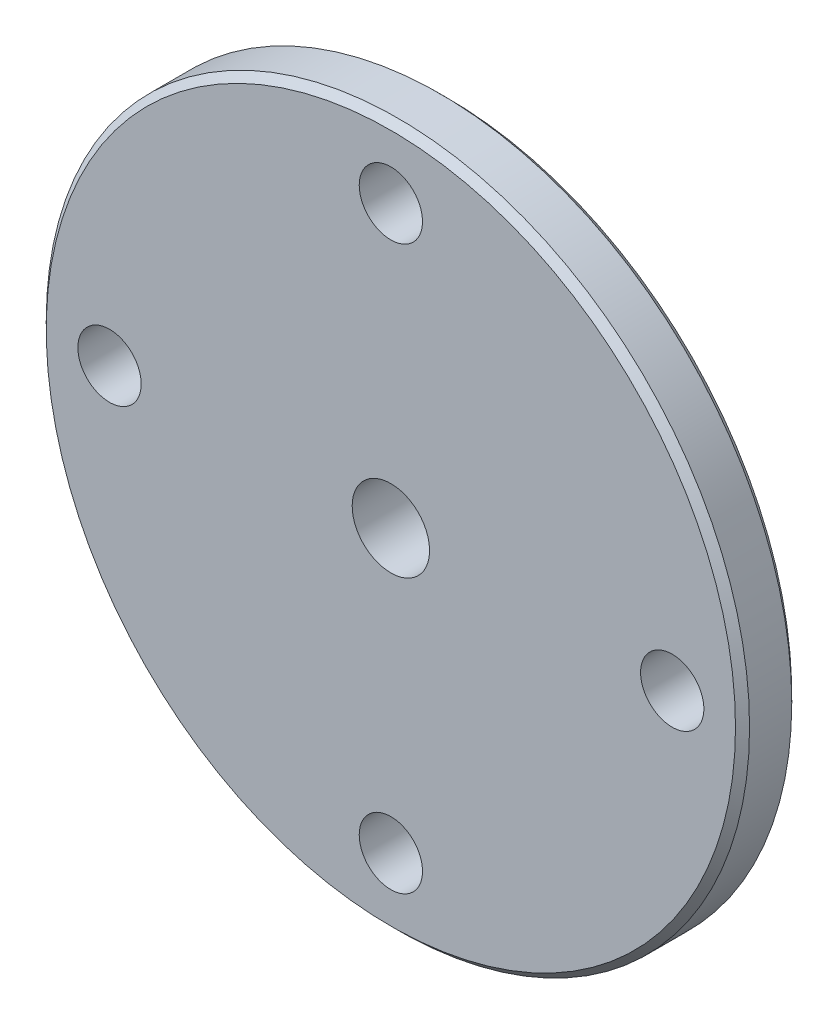
ISO-10303-21;
HEADER;
FILE_DESCRIPTION(('STEP AP214'),'2;1');
FILE_NAME('part.step','',(''),(''),'','','');
FILE_SCHEMA(('AUTOMOTIVE_DESIGN { 1 0 10303 214 1 1 1 1 }'));
ENDSEC;
DATA;
#1=APPLICATION_CONTEXT('core data for automotive mechanical design processes');
#2=APPLICATION_PROTOCOL_DEFINITION('international standard','automotive_design',2000,#1);
#3=PRODUCT_CONTEXT('',#1,'mechanical');
#4=PRODUCT('Part','Part','',(#3));
#5=PRODUCT_RELATED_PRODUCT_CATEGORY('part','',(#4));
#6=PRODUCT_DEFINITION_FORMATION('','',#4);
#7=PRODUCT_DEFINITION_CONTEXT('part definition',#1,'design');
#8=PRODUCT_DEFINITION('design','',#6,#7);
#9=PRODUCT_DEFINITION_SHAPE('','',#8);
#10=(LENGTH_UNIT() NAMED_UNIT(*) SI_UNIT(.MILLI.,.METRE.));
#11=(NAMED_UNIT(*) PLANE_ANGLE_UNIT() SI_UNIT($,.RADIAN.));
#12=(NAMED_UNIT(*) SI_UNIT($,.STERADIAN.) SOLID_ANGLE_UNIT());
#13=UNCERTAINTY_MEASURE_WITH_UNIT(LENGTH_MEASURE(1.E-05),#10,'distance_accuracy_value','');
#14=(GEOMETRIC_REPRESENTATION_CONTEXT(3) GLOBAL_UNCERTAINTY_ASSIGNED_CONTEXT((#13)) GLOBAL_UNIT_ASSIGNED_CONTEXT((#10,
#11,#12)) REPRESENTATION_CONTEXT('',''));
#15=CARTESIAN_POINT('',(0.,0.,0.));
#16=DIRECTION('',(0.,0.,1.));
#17=DIRECTION('',(1.,0.,0.));
#18=AXIS2_PLACEMENT_3D('',#15,#16,#17);
#19=CARTESIAN_POINT('',(0.,0.,0.));
#20=DIRECTION('',(0.,0.,1.));
#21=DIRECTION('',(1.,0.,0.));
#22=AXIS2_PLACEMENT_3D('',#19,#20,#21);
#23=CYLINDRICAL_SURFACE('',#22,25.);
#24=CARTESIAN_POINT('',(0.,0.,0.50000000000705));
#25=DIRECTION('',(0.,0.,-1.));
#26=DIRECTION('',(-1.,0.,0.));
#27=AXIS2_PLACEMENT_3D('',#24,#25,#26);
#28=CIRCLE('',#27,25.);
#29=CARTESIAN_POINT('',(-25.,0.,0.50000000000705));
#30=VERTEX_POINT('',#29);
#31=EDGE_CURVE('E56',#30,#30,#28,.F.);
#32=ORIENTED_EDGE('',*,*,#31,.T.);
#33=EDGE_LOOP('',(#32));
#34=FACE_BOUND('',#33,.T.);
#35=CARTESIAN_POINT('',(0.,0.,3.49999999999309));
#36=DIRECTION('',(0.,0.,1.));
#37=DIRECTION('',(1.,0.,0.));
#38=AXIS2_PLACEMENT_3D('',#35,#36,#37);
#39=CIRCLE('',#38,25.);
#40=CARTESIAN_POINT('',(25.,0.,3.49999999999309));
#41=VERTEX_POINT('',#40);
#42=EDGE_CURVE('E61',#41,#41,#39,.F.);
#43=ORIENTED_EDGE('',*,*,#42,.T.);
#44=EDGE_LOOP('',(#43));
#45=FACE_BOUND('',#44,.T.);
#46=ADVANCED_FACE('F44',(#34,#45),#23,.T.);
#47=CARTESIAN_POINT('',(25.,0.,0.));
#48=DIRECTION('',(0.,0.,-1.));
#49=DIRECTION('',(-1.,0.,0.));
#50=AXIS2_PLACEMENT_3D('',#47,#48,#49);
#51=PLANE('',#50);
#52=CARTESIAN_POINT('',(0.,0.,0.));
#53=DIRECTION('',(0.,0.,-1.));
#54=DIRECTION('',(-1.,0.,0.));
#55=AXIS2_PLACEMENT_3D('',#52,#53,#54);
#56=CIRCLE('',#55,24.4999999999931);
#57=CARTESIAN_POINT('',(-24.4999999999931,0.,0.));
#58=VERTEX_POINT('',#57);
#59=EDGE_CURVE('E53',#58,#58,#56,.T.);
#60=ORIENTED_EDGE('',*,*,#59,.T.);
#61=EDGE_LOOP('',(#60));
#62=FACE_BOUND('',#61,.T.);
#63=CARTESIAN_POINT('',(0.,20.,0.));
#64=DIRECTION('',(0.,0.,-1.));
#65=DIRECTION('',(-1.,0.,0.));
#66=AXIS2_PLACEMENT_3D('',#63,#64,#65);
#67=CIRCLE('',#66,2.24999999999999);
#68=CARTESIAN_POINT('',(-2.24999999999999,20.,0.));
#69=VERTEX_POINT('',#68);
#70=EDGE_CURVE('E106',#69,#69,#67,.T.);
#71=ORIENTED_EDGE('',*,*,#70,.F.);
#72=EDGE_LOOP('',(#71));
#73=FACE_BOUND('',#72,.T.);
#74=CARTESIAN_POINT('',(20.,0.,0.));
#75=DIRECTION('',(0.,0.,-1.));
#76=DIRECTION('',(-1.,0.,0.));
#77=AXIS2_PLACEMENT_3D('',#74,#75,#76);
#78=CIRCLE('',#77,2.24999999999999);
#79=CARTESIAN_POINT('',(17.75,0.,0.));
#80=VERTEX_POINT('',#79);
#81=EDGE_CURVE('E98',#80,#80,#78,.T.);
#82=ORIENTED_EDGE('',*,*,#81,.F.);
#83=EDGE_LOOP('',(#82));
#84=FACE_BOUND('',#83,.T.);
#85=CARTESIAN_POINT('',(0.,-20.,0.));
#86=DIRECTION('',(0.,0.,-1.));
#87=DIRECTION('',(-1.,0.,0.));
#88=AXIS2_PLACEMENT_3D('',#85,#86,#87);
#89=CIRCLE('',#88,2.24999999999999);
#90=CARTESIAN_POINT('',(-2.24999999999999,-20.,0.));
#91=VERTEX_POINT('',#90);
#92=EDGE_CURVE('E89',#91,#91,#89,.T.);
#93=ORIENTED_EDGE('',*,*,#92,.F.);
#94=EDGE_LOOP('',(#93));
#95=FACE_BOUND('',#94,.T.);
#96=CARTESIAN_POINT('',(-20.,0.,0.));
#97=DIRECTION('',(0.,0.,-1.));
#98=DIRECTION('',(-1.,0.,0.));
#99=AXIS2_PLACEMENT_3D('',#96,#97,#98);
#100=CIRCLE('',#99,2.24999999999999);
#101=CARTESIAN_POINT('',(-22.25,0.,0.));
#102=VERTEX_POINT('',#101);
#103=EDGE_CURVE('E84',#102,#102,#100,.T.);
#104=ORIENTED_EDGE('',*,*,#103,.F.);
#105=EDGE_LOOP('',(#104));
#106=FACE_BOUND('',#105,.T.);
#107=CARTESIAN_POINT('',(0.,0.,0.));
#108=DIRECTION('',(0.,0.,-1.));
#109=DIRECTION('',(-1.,0.,0.));
#110=AXIS2_PLACEMENT_3D('',#107,#108,#109);
#111=CIRCLE('',#110,2.74999999999999);
#112=CARTESIAN_POINT('',(-2.74999999999999,0.,0.));
#113=VERTEX_POINT('',#112);
#114=EDGE_CURVE('E74',#113,#113,#111,.T.);
#115=ORIENTED_EDGE('',*,*,#114,.F.);
#116=EDGE_LOOP('',(#115));
#117=FACE_BOUND('',#116,.T.);
#118=ADVANCED_FACE('F114',(#62,#73,#84,#95,#106,#117),#51,.T.);
#119=CARTESIAN_POINT('',(0.,0.,4.));
#120=DIRECTION('',(0.,0.,1.));
#121=DIRECTION('',(1.,0.,0.));
#122=AXIS2_PLACEMENT_3D('',#119,#120,#121);
#123=PLANE('',#122);
#124=CARTESIAN_POINT('',(0.,0.,4.));
#125=DIRECTION('',(0.,0.,1.));
#126=DIRECTION('',(1.,0.,0.));
#127=AXIS2_PLACEMENT_3D('',#124,#125,#126);
#128=CIRCLE('',#127,24.499999999993);
#129=CARTESIAN_POINT('',(24.499999999993,0.,4.));
#130=VERTEX_POINT('',#129);
#131=EDGE_CURVE('E10',#130,#130,#128,.T.);
#132=ORIENTED_EDGE('',*,*,#131,.T.);
#133=EDGE_LOOP('',(#132));
#134=FACE_BOUND('',#133,.T.);
#135=CARTESIAN_POINT('',(0.,20.,4.));
#136=DIRECTION('',(0.,0.,-1.));
#137=DIRECTION('',(-1.,0.,0.));
#138=AXIS2_PLACEMENT_3D('',#135,#136,#137);
#139=CIRCLE('',#138,2.24999999999999);
#140=CARTESIAN_POINT('',(-2.24999999999999,20.,4.));
#141=VERTEX_POINT('',#140);
#142=EDGE_CURVE('E105',#141,#141,#139,.T.);
#143=ORIENTED_EDGE('',*,*,#142,.T.);
#144=EDGE_LOOP('',(#143));
#145=FACE_BOUND('',#144,.T.);
#146=CARTESIAN_POINT('',(20.,0.,4.));
#147=DIRECTION('',(0.,0.,-1.));
#148=DIRECTION('',(-1.,0.,0.));
#149=AXIS2_PLACEMENT_3D('',#146,#147,#148);
#150=CIRCLE('',#149,2.24999999999999);
#151=CARTESIAN_POINT('',(17.75,0.,4.));
#152=VERTEX_POINT('',#151);
#153=EDGE_CURVE('E94',#152,#152,#150,.T.);
#154=ORIENTED_EDGE('',*,*,#153,.T.);
#155=EDGE_LOOP('',(#154));
#156=FACE_BOUND('',#155,.T.);
#157=CARTESIAN_POINT('',(0.,-20.,4.));
#158=DIRECTION('',(0.,0.,-1.));
#159=DIRECTION('',(-1.,0.,0.));
#160=AXIS2_PLACEMENT_3D('',#157,#158,#159);
#161=CIRCLE('',#160,2.24999999999999);
#162=CARTESIAN_POINT('',(-2.24999999999999,-20.,4.));
#163=VERTEX_POINT('',#162);
#164=EDGE_CURVE('E88',#163,#163,#161,.T.);
#165=ORIENTED_EDGE('',*,*,#164,.T.);
#166=EDGE_LOOP('',(#165));
#167=FACE_BOUND('',#166,.T.);
#168=CARTESIAN_POINT('',(-20.,0.,4.));
#169=DIRECTION('',(0.,0.,-1.));
#170=DIRECTION('',(-1.,0.,0.));
#171=AXIS2_PLACEMENT_3D('',#168,#169,#170);
#172=CIRCLE('',#171,2.24999999999999);
#173=CARTESIAN_POINT('',(-22.25,0.,4.));
#174=VERTEX_POINT('',#173);
#175=EDGE_CURVE('E80',#174,#174,#172,.T.);
#176=ORIENTED_EDGE('',*,*,#175,.T.);
#177=EDGE_LOOP('',(#176));
#178=FACE_BOUND('',#177,.T.);
#179=CARTESIAN_POINT('',(0.,0.,4.));
#180=DIRECTION('',(0.,0.,-1.));
#181=DIRECTION('',(-1.,0.,0.));
#182=AXIS2_PLACEMENT_3D('',#179,#180,#181);
#183=CIRCLE('',#182,2.74999999999999);
#184=CARTESIAN_POINT('',(-2.74999999999999,0.,4.));
#185=VERTEX_POINT('',#184);
#186=EDGE_CURVE('E66',#185,#185,#183,.T.);
#187=ORIENTED_EDGE('',*,*,#186,.T.);
#188=EDGE_LOOP('',(#187));
#189=FACE_BOUND('',#188,.T.);
#190=ADVANCED_FACE('F117',(#134,#145,#156,#167,#178,#189),#123,.T.);
#191=CARTESIAN_POINT('',(0.,0.,0.));
#192=DIRECTION('',(0.,0.,-1.));
#193=DIRECTION('',(-1.,0.,0.));
#194=AXIS2_PLACEMENT_3D('',#191,#192,#193);
#195=CYLINDRICAL_SURFACE('',#194,2.74999999999999);
#196=ORIENTED_EDGE('',*,*,#186,.F.);
#197=EDGE_LOOP('',(#196));
#198=FACE_BOUND('',#197,.T.);
#199=ORIENTED_EDGE('',*,*,#114,.T.);
#200=EDGE_LOOP('',(#199));
#201=FACE_BOUND('',#200,.T.);
#202=ADVANCED_FACE('F127',(#198,#201),#195,.F.);
#203=CARTESIAN_POINT('',(-20.,0.,0.));
#204=DIRECTION('',(0.,0.,-1.));
#205=DIRECTION('',(-1.,0.,0.));
#206=AXIS2_PLACEMENT_3D('',#203,#204,#205);
#207=CYLINDRICAL_SURFACE('',#206,2.24999999999999);
#208=ORIENTED_EDGE('',*,*,#175,.F.);
#209=EDGE_LOOP('',(#208));
#210=FACE_BOUND('',#209,.T.);
#211=ORIENTED_EDGE('',*,*,#103,.T.);
#212=EDGE_LOOP('',(#211));
#213=FACE_BOUND('',#212,.T.);
#214=ADVANCED_FACE('F126',(#210,#213),#207,.F.);
#215=CARTESIAN_POINT('',(0.,-20.,0.));
#216=DIRECTION('',(0.,0.,-1.));
#217=DIRECTION('',(-1.,0.,0.));
#218=AXIS2_PLACEMENT_3D('',#215,#216,#217);
#219=CYLINDRICAL_SURFACE('',#218,2.24999999999999);
#220=ORIENTED_EDGE('',*,*,#164,.F.);
#221=EDGE_LOOP('',(#220));
#222=FACE_BOUND('',#221,.T.);
#223=ORIENTED_EDGE('',*,*,#92,.T.);
#224=EDGE_LOOP('',(#223));
#225=FACE_BOUND('',#224,.T.);
#226=ADVANCED_FACE('F131',(#222,#225),#219,.F.);
#227=CARTESIAN_POINT('',(20.,0.,0.));
#228=DIRECTION('',(0.,0.,-1.));
#229=DIRECTION('',(-1.,0.,0.));
#230=AXIS2_PLACEMENT_3D('',#227,#228,#229);
#231=CYLINDRICAL_SURFACE('',#230,2.24999999999999);
#232=ORIENTED_EDGE('',*,*,#153,.F.);
#233=EDGE_LOOP('',(#232));
#234=FACE_BOUND('',#233,.T.);
#235=ORIENTED_EDGE('',*,*,#81,.T.);
#236=EDGE_LOOP('',(#235));
#237=FACE_BOUND('',#236,.T.);
#238=ADVANCED_FACE('F160',(#234,#237),#231,.F.);
#239=CARTESIAN_POINT('',(0.,20.,0.));
#240=DIRECTION('',(0.,0.,-1.));
#241=DIRECTION('',(-1.,0.,0.));
#242=AXIS2_PLACEMENT_3D('',#239,#240,#241);
#243=CYLINDRICAL_SURFACE('',#242,2.24999999999999);
#244=ORIENTED_EDGE('',*,*,#142,.F.);
#245=EDGE_LOOP('',(#244));
#246=FACE_BOUND('',#245,.T.);
#247=ORIENTED_EDGE('',*,*,#70,.T.);
#248=EDGE_LOOP('',(#247));
#249=FACE_BOUND('',#248,.T.);
#250=ADVANCED_FACE('F112',(#246,#249),#243,.F.);
#251=CARTESIAN_POINT('',(0.,0.,0.50000000000705));
#252=DIRECTION('',(0.,0.,1.));
#253=DIRECTION('',(1.,0.,0.));
#254=AXIS2_PLACEMENT_3D('',#251,#252,#253);
#255=CONICAL_SURFACE('',#254,25.,0.785398163397306);
#256=ORIENTED_EDGE('',*,*,#59,.F.);
#257=EDGE_LOOP('',(#256));
#258=FACE_BOUND('',#257,.T.);
#259=ORIENTED_EDGE('',*,*,#31,.F.);
#260=EDGE_LOOP('',(#259));
#261=FACE_BOUND('',#260,.T.);
#262=ADVANCED_FACE('F146',(#258,#261),#255,.T.);
#263=CARTESIAN_POINT('',(0.,0.,4.));
#264=DIRECTION('',(0.,0.,-1.));
#265=DIRECTION('',(-1.,0.,0.));
#266=AXIS2_PLACEMENT_3D('',#263,#264,#265);
#267=CONICAL_SURFACE('',#266,24.499999999993,0.785398163397587);
#268=ORIENTED_EDGE('',*,*,#42,.F.);
#269=EDGE_LOOP('',(#268));
#270=FACE_BOUND('',#269,.T.);
#271=ORIENTED_EDGE('',*,*,#131,.F.);
#272=EDGE_LOOP('',(#271));
#273=FACE_BOUND('',#272,.T.);
#274=ADVANCED_FACE('F48',(#270,#273),#267,.T.);
#275=CLOSED_SHELL('',(#46,#118,#190,#202,#214,#226,#238,#250,#262,#274));
#276=MANIFOLD_SOLID_BREP('B2',#275);
#277=ADVANCED_BREP_SHAPE_REPRESENTATION('',(#18,#276),#14);
#278=SHAPE_DEFINITION_REPRESENTATION(#9,#277);
ENDSEC;
END-ISO-10303-21;
